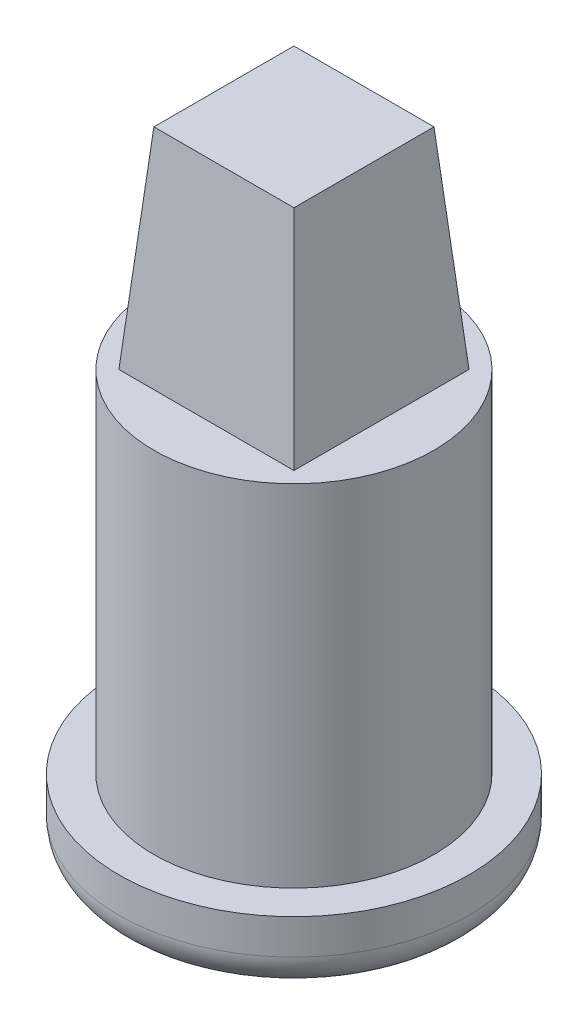
ISO-10303-21;
HEADER;
FILE_DESCRIPTION(('STEP AP214'),'2;1');
FILE_NAME('part.step','',(''),(''),'','','');
FILE_SCHEMA(('AUTOMOTIVE_DESIGN { 1 0 10303 214 1 1 1 1 }'));
ENDSEC;
DATA;
#1=APPLICATION_CONTEXT('core data for automotive mechanical design processes');
#2=APPLICATION_PROTOCOL_DEFINITION('international standard','automotive_design',2000,#1);
#3=PRODUCT_CONTEXT('',#1,'mechanical');
#4=PRODUCT('Part','Part','',(#3));
#5=PRODUCT_RELATED_PRODUCT_CATEGORY('part','',(#4));
#6=PRODUCT_DEFINITION_FORMATION('','',#4);
#7=PRODUCT_DEFINITION_CONTEXT('part definition',#1,'design');
#8=PRODUCT_DEFINITION('design','',#6,#7);
#9=PRODUCT_DEFINITION_SHAPE('','',#8);
#10=(LENGTH_UNIT() NAMED_UNIT(*) SI_UNIT(.MILLI.,.METRE.));
#11=(NAMED_UNIT(*) PLANE_ANGLE_UNIT() SI_UNIT($,.RADIAN.));
#12=(NAMED_UNIT(*) SI_UNIT($,.STERADIAN.) SOLID_ANGLE_UNIT());
#13=UNCERTAINTY_MEASURE_WITH_UNIT(LENGTH_MEASURE(1.E-05),#10,'distance_accuracy_value','');
#14=(GEOMETRIC_REPRESENTATION_CONTEXT(3) GLOBAL_UNCERTAINTY_ASSIGNED_CONTEXT((#13)) GLOBAL_UNIT_ASSIGNED_CONTEXT((#10,
#11,#12)) REPRESENTATION_CONTEXT('',''));
#15=CARTESIAN_POINT('',(0.,0.,0.));
#16=DIRECTION('',(0.,0.,1.));
#17=DIRECTION('',(1.,0.,0.));
#18=AXIS2_PLACEMENT_3D('',#15,#16,#17);
#19=CARTESIAN_POINT('',(0.,24.,0.));
#20=DIRECTION('',(0.,1.,0.));
#21=DIRECTION('',(0.,0.,1.));
#22=AXIS2_PLACEMENT_3D('',#19,#20,#21);
#23=PLANE('',#22);
#24=CARTESIAN_POINT('',(0.,24.,0.));
#25=DIRECTION('',(0.,-1.,0.));
#26=DIRECTION('',(0.,0.,-1.));
#27=AXIS2_PLACEMENT_3D('',#24,#25,#26);
#28=CIRCLE('',#27,8.);
#29=CARTESIAN_POINT('',(0.,24.,-8.));
#30=VERTEX_POINT('',#29);
#31=EDGE_CURVE('E12',#30,#30,#28,.T.);
#32=ORIENTED_EDGE('',*,*,#31,.F.);
#33=EDGE_LOOP('',(#32));
#34=FACE_BOUND('',#33,.T.);
#35=DIRECTION('',(-1.,0.,0.));
#36=VECTOR('',#35,1.);
#37=CARTESIAN_POINT('',(-5.,24.,-5.));
#38=LINE('',#37,#36);
#39=CARTESIAN_POINT('',(5.,24.,-5.));
#40=VERTEX_POINT('',#39);
#41=CARTESIAN_POINT('',(-5.,24.,-5.));
#42=VERTEX_POINT('',#41);
#43=EDGE_CURVE('E189',#40,#42,#38,.T.);
#44=ORIENTED_EDGE('',*,*,#43,.F.);
#45=DIRECTION('',(0.,0.,-1.));
#46=VECTOR('',#45,1.);
#47=CARTESIAN_POINT('',(5.,24.,5.));
#48=LINE('',#47,#46);
#49=CARTESIAN_POINT('',(5.,24.,5.));
#50=VERTEX_POINT('',#49);
#51=EDGE_CURVE('E106',#50,#40,#48,.T.);
#52=ORIENTED_EDGE('',*,*,#51,.F.);
#53=DIRECTION('',(1.,0.,0.));
#54=VECTOR('',#53,1.);
#55=CARTESIAN_POINT('',(-5.,24.,5.));
#56=LINE('',#55,#54);
#57=CARTESIAN_POINT('',(-5.,24.,5.));
#58=VERTEX_POINT('',#57);
#59=EDGE_CURVE('E178',#58,#50,#56,.T.);
#60=ORIENTED_EDGE('',*,*,#59,.F.);
#61=DIRECTION('',(0.,0.,1.));
#62=VECTOR('',#61,1.);
#63=CARTESIAN_POINT('',(-5.,24.,5.));
#64=LINE('',#63,#62);
#65=EDGE_CURVE('E102',#42,#58,#64,.T.);
#66=ORIENTED_EDGE('',*,*,#65,.F.);
#67=EDGE_LOOP('',(#44,#52,#60,#66));
#68=FACE_BOUND('',#67,.T.);
#69=ADVANCED_FACE('F49',(#34,#68),#23,.T.);
#70=CARTESIAN_POINT('',(7.99999999999999,0.,0.));
#71=DIRECTION('',(0.,-1.,0.));
#72=DIRECTION('',(0.,0.,-1.));
#73=AXIS2_PLACEMENT_3D('',#70,#71,#72);
#74=PLANE('',#73);
#75=CARTESIAN_POINT('',(0.,0.,0.));
#76=DIRECTION('',(0.,-1.,0.));
#77=DIRECTION('',(0.,0.,-1.));
#78=AXIS2_PLACEMENT_3D('',#75,#76,#77);
#79=CIRCLE('',#78,7.99999999999999);
#80=CARTESIAN_POINT('',(0.,0.,-7.99999999999999));
#81=VERTEX_POINT('',#80);
#82=EDGE_CURVE('E168',#81,#81,#79,.T.);
#83=ORIENTED_EDGE('',*,*,#82,.T.);
#84=EDGE_LOOP('',(#83));
#85=FACE_BOUND('',#84,.T.);
#86=ADVANCED_FACE('F51',(#85),#74,.T.);
#87=CARTESIAN_POINT('',(0.,0.,0.));
#88=DIRECTION('',(0.,-1.,0.));
#89=DIRECTION('',(0.,0.,-1.));
#90=AXIS2_PLACEMENT_3D('',#87,#88,#89);
#91=CYLINDRICAL_SURFACE('',#90,8.);
#92=ORIENTED_EDGE('',*,*,#31,.T.);
#93=EDGE_LOOP('',(#92));
#94=FACE_BOUND('',#93,.T.);
#95=CARTESIAN_POINT('',(0.,4.,0.));
#96=DIRECTION('',(0.,-1.,0.));
#97=DIRECTION('',(0.,0.,-1.));
#98=AXIS2_PLACEMENT_3D('',#95,#96,#97);
#99=CIRCLE('',#98,8.);
#100=CARTESIAN_POINT('',(0.,4.,-8.));
#101=VERTEX_POINT('',#100);
#102=EDGE_CURVE('E59',#101,#101,#99,.T.);
#103=ORIENTED_EDGE('',*,*,#102,.F.);
#104=EDGE_LOOP('',(#103));
#105=FACE_BOUND('',#104,.T.);
#106=ADVANCED_FACE('F268',(#94,#105),#91,.T.);
#107=CARTESIAN_POINT('',(8.,4.,0.));
#108=DIRECTION('',(0.,1.,0.));
#109=DIRECTION('',(0.,0.,1.));
#110=AXIS2_PLACEMENT_3D('',#107,#108,#109);
#111=PLANE('',#110);
#112=ORIENTED_EDGE('',*,*,#102,.T.);
#113=EDGE_LOOP('',(#112));
#114=FACE_BOUND('',#113,.T.);
#115=CARTESIAN_POINT('',(0.,4.,0.));
#116=DIRECTION('',(0.,-1.,0.));
#117=DIRECTION('',(0.,0.,-1.));
#118=AXIS2_PLACEMENT_3D('',#115,#116,#117);
#119=CIRCLE('',#118,10.);
#120=CARTESIAN_POINT('',(0.,4.,-10.));
#121=VERTEX_POINT('',#120);
#122=EDGE_CURVE('E182',#121,#121,#119,.T.);
#123=ORIENTED_EDGE('',*,*,#122,.F.);
#124=EDGE_LOOP('',(#123));
#125=FACE_BOUND('',#124,.T.);
#126=ADVANCED_FACE('F264',(#114,#125),#111,.T.);
#127=CARTESIAN_POINT('',(0.,0.,0.));
#128=DIRECTION('',(0.,-1.,0.));
#129=DIRECTION('',(0.,0.,-1.));
#130=AXIS2_PLACEMENT_3D('',#127,#128,#129);
#131=CYLINDRICAL_SURFACE('',#130,10.);
#132=ORIENTED_EDGE('',*,*,#122,.T.);
#133=EDGE_LOOP('',(#132));
#134=FACE_BOUND('',#133,.T.);
#135=CARTESIAN_POINT('',(0.,2.00000000000001,0.));
#136=DIRECTION('',(0.,-1.,0.));
#137=DIRECTION('',(0.,0.,-1.));
#138=AXIS2_PLACEMENT_3D('',#135,#136,#137);
#139=CIRCLE('',#138,10.);
#140=CARTESIAN_POINT('',(0.,2.00000000000001,-10.));
#141=VERTEX_POINT('',#140);
#142=EDGE_CURVE('E177',#141,#141,#139,.T.);
#143=ORIENTED_EDGE('',*,*,#142,.F.);
#144=EDGE_LOOP('',(#143));
#145=FACE_BOUND('',#144,.T.);
#146=ADVANCED_FACE('F260',(#134,#145),#131,.T.);
#147=CARTESIAN_POINT('',(0.,2.,0.));
#148=DIRECTION('',(0.,-1.,0.));
#149=DIRECTION('',(0.,0.,-1.));
#150=AXIS2_PLACEMENT_3D('',#147,#148,#149);
#151=TOROIDAL_SURFACE('',#150,8.,2.);
#152=ORIENTED_EDGE('',*,*,#142,.T.);
#153=EDGE_LOOP('',(#152));
#154=FACE_BOUND('',#153,.T.);
#155=ORIENTED_EDGE('',*,*,#82,.F.);
#156=EDGE_LOOP('',(#155));
#157=FACE_BOUND('',#156,.T.);
#158=ADVANCED_FACE('F141',(#154,#157),#151,.T.);
#159=CARTESIAN_POINT('',(0.,36.,0.));
#160=DIRECTION('',(0.,-1.,0.));
#161=DIRECTION('',(0.,0.,-1.));
#162=AXIS2_PLACEMENT_3D('',#159,#160,#161);
#163=PLANE('',#162);
#164=DIRECTION('',(0.,0.,-1.));
#165=VECTOR('',#164,1.);
#166=CARTESIAN_POINT('',(4.,36.,4.));
#167=LINE('',#166,#165);
#168=CARTESIAN_POINT('',(4.,36.,4.));
#169=VERTEX_POINT('',#168);
#170=CARTESIAN_POINT('',(4.,36.,-4.));
#171=VERTEX_POINT('',#170);
#172=EDGE_CURVE('E163',#169,#171,#167,.T.);
#173=ORIENTED_EDGE('',*,*,#172,.T.);
#174=DIRECTION('',(-1.,0.,0.));
#175=VECTOR('',#174,1.);
#176=CARTESIAN_POINT('',(-4.,36.,-4.));
#177=LINE('',#176,#175);
#178=CARTESIAN_POINT('',(-4.,36.,-4.));
#179=VERTEX_POINT('',#178);
#180=EDGE_CURVE('E120',#171,#179,#177,.T.);
#181=ORIENTED_EDGE('',*,*,#180,.T.);
#182=DIRECTION('',(0.,0.,1.));
#183=VECTOR('',#182,1.);
#184=CARTESIAN_POINT('',(-4.,36.,4.));
#185=LINE('',#184,#183);
#186=CARTESIAN_POINT('',(-4.,36.,4.));
#187=VERTEX_POINT('',#186);
#188=EDGE_CURVE('E98',#179,#187,#185,.T.);
#189=ORIENTED_EDGE('',*,*,#188,.T.);
#190=DIRECTION('',(1.,0.,0.));
#191=VECTOR('',#190,1.);
#192=CARTESIAN_POINT('',(-4.,36.,4.));
#193=LINE('',#192,#191);
#194=EDGE_CURVE('E108',#187,#169,#193,.T.);
#195=ORIENTED_EDGE('',*,*,#194,.T.);
#196=EDGE_LOOP('',(#173,#181,#189,#195));
#197=FACE_BOUND('',#196,.T.);
#198=ADVANCED_FACE('F119',(#197),#163,.F.);
#199=CARTESIAN_POINT('',(0.,0.579310344827585,-6.95172413793103));
#200=DIRECTION('',(0.,0.0830454798537399,-0.99654575824488));
#201=DIRECTION('',(0.,0.99654575824488,0.0830454798537399));
#202=AXIS2_PLACEMENT_3D('',#199,#200,#201);
#203=PLANE('',#202);
#204=DIRECTION('',(0.0827605888602367,-0.993127066322842,-0.0827605888602367));
#205=VECTOR('',#204,1.);
#206=CARTESIAN_POINT('',(4.,36.,-4.));
#207=LINE('',#206,#205);
#208=EDGE_CURVE('E67',#171,#40,#207,.T.);
#209=ORIENTED_EDGE('',*,*,#208,.T.);
#210=ORIENTED_EDGE('',*,*,#43,.T.);
#211=DIRECTION('',(-0.0827605888602368,-0.993127066322842,-0.0827605888602367));
#212=VECTOR('',#211,1.);
#213=CARTESIAN_POINT('',(-4.,36.,-4.));
#214=LINE('',#213,#212);
#215=EDGE_CURVE('E206',#179,#42,#214,.T.);
#216=ORIENTED_EDGE('',*,*,#215,.F.);
#217=ORIENTED_EDGE('',*,*,#180,.F.);
#218=EDGE_LOOP('',(#209,#210,#216,#217));
#219=FACE_BOUND('',#218,.T.);
#220=ADVANCED_FACE('F140',(#219),#203,.T.);
#221=CARTESIAN_POINT('',(-6.95172413793104,0.579310344827587,0.));
#222=DIRECTION('',(-0.99654575824488,0.08304547985374,0.));
#223=DIRECTION('',(-0.08304547985374,-0.99654575824488,0.));
#224=AXIS2_PLACEMENT_3D('',#221,#222,#223);
#225=PLANE('',#224);
#226=ORIENTED_EDGE('',*,*,#215,.T.);
#227=ORIENTED_EDGE('',*,*,#65,.T.);
#228=DIRECTION('',(-0.0827605888602368,-0.993127066322842,0.0827605888602368));
#229=VECTOR('',#228,1.);
#230=CARTESIAN_POINT('',(-4.,36.,4.));
#231=LINE('',#230,#229);
#232=EDGE_CURVE('E93',#187,#58,#231,.T.);
#233=ORIENTED_EDGE('',*,*,#232,.F.);
#234=ORIENTED_EDGE('',*,*,#188,.F.);
#235=EDGE_LOOP('',(#226,#227,#233,#234));
#236=FACE_BOUND('',#235,.T.);
#237=ADVANCED_FACE('F96',(#236),#225,.T.);
#238=CARTESIAN_POINT('',(6.95172413793103,0.579310344827585,0.));
#239=DIRECTION('',(0.99654575824488,0.0830454798537399,0.));
#240=DIRECTION('',(-0.0830454798537399,0.99654575824488,0.));
#241=AXIS2_PLACEMENT_3D('',#238,#239,#240);
#242=PLANE('',#241);
#243=DIRECTION('',(0.0827605888602367,-0.993127066322842,0.0827605888602368));
#244=VECTOR('',#243,1.);
#245=CARTESIAN_POINT('',(4.,36.,4.));
#246=LINE('',#245,#244);
#247=EDGE_CURVE('E74',#169,#50,#246,.T.);
#248=ORIENTED_EDGE('',*,*,#247,.T.);
#249=ORIENTED_EDGE('',*,*,#51,.T.);
#250=ORIENTED_EDGE('',*,*,#208,.F.);
#251=ORIENTED_EDGE('',*,*,#172,.F.);
#252=EDGE_LOOP('',(#248,#249,#250,#251));
#253=FACE_BOUND('',#252,.T.);
#254=ADVANCED_FACE('F204',(#253),#242,.T.);
#255=CARTESIAN_POINT('',(0.,0.579310344827586,6.95172413793104));
#256=DIRECTION('',(0.,0.08304547985374,0.99654575824488));
#257=DIRECTION('',(0.,-0.99654575824488,0.08304547985374));
#258=AXIS2_PLACEMENT_3D('',#255,#256,#257);
#259=PLANE('',#258);
#260=ORIENTED_EDGE('',*,*,#232,.T.);
#261=ORIENTED_EDGE('',*,*,#59,.T.);
#262=ORIENTED_EDGE('',*,*,#247,.F.);
#263=ORIENTED_EDGE('',*,*,#194,.F.);
#264=EDGE_LOOP('',(#260,#261,#262,#263));
#265=FACE_BOUND('',#264,.T.);
#266=ADVANCED_FACE('F110',(#265),#259,.T.);
#267=CLOSED_SHELL('',(#69,#86,#106,#126,#146,#158,#198,#220,#237,#254,#266));
#268=MANIFOLD_SOLID_BREP('B2',#267);
#269=ADVANCED_BREP_SHAPE_REPRESENTATION('',(#18,#268),#14);
#270=SHAPE_DEFINITION_REPRESENTATION(#9,#269);
ENDSEC;
END-ISO-10303-21;
